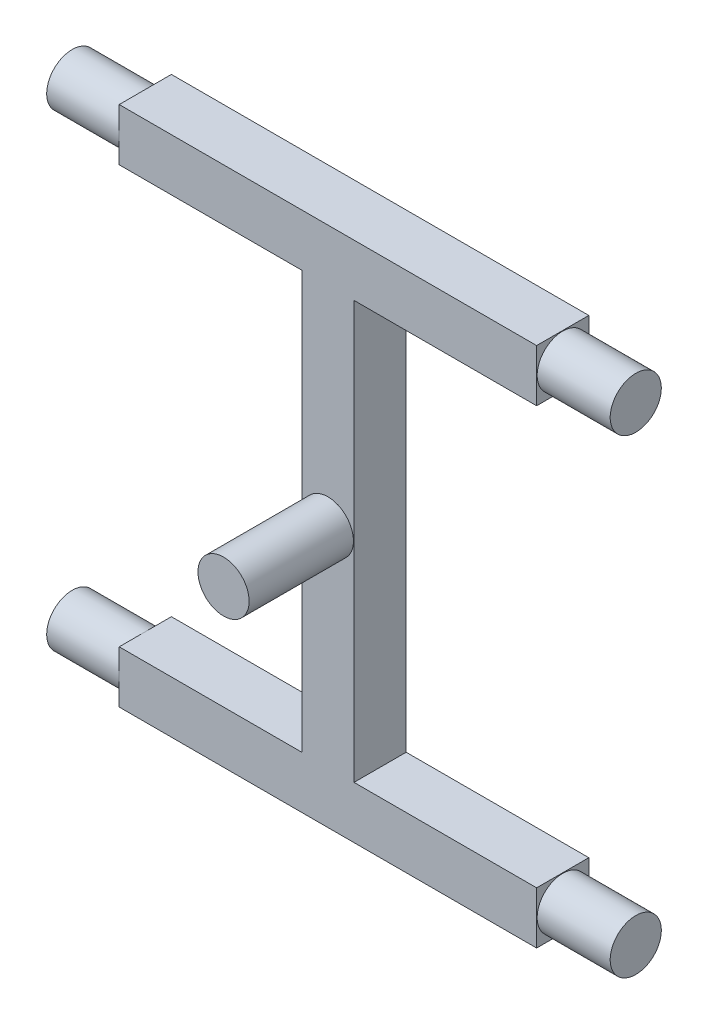
ISO-10303-21;
HEADER;
FILE_DESCRIPTION(('STEP AP214'),'2;1');
FILE_NAME('part.step','',(''),(''),'','','');
FILE_SCHEMA(('AUTOMOTIVE_DESIGN { 1 0 10303 214 1 1 1 1 }'));
ENDSEC;
DATA;
#1=APPLICATION_CONTEXT('core data for automotive mechanical design processes');
#2=APPLICATION_PROTOCOL_DEFINITION('international standard','automotive_design',2000,#1);
#3=PRODUCT_CONTEXT('',#1,'mechanical');
#4=PRODUCT('Part','Part','',(#3));
#5=PRODUCT_RELATED_PRODUCT_CATEGORY('part','',(#4));
#6=PRODUCT_DEFINITION_FORMATION('','',#4);
#7=PRODUCT_DEFINITION_CONTEXT('part definition',#1,'design');
#8=PRODUCT_DEFINITION('design','',#6,#7);
#9=PRODUCT_DEFINITION_SHAPE('','',#8);
#10=(LENGTH_UNIT() NAMED_UNIT(*) SI_UNIT(.MILLI.,.METRE.));
#11=(NAMED_UNIT(*) PLANE_ANGLE_UNIT() SI_UNIT($,.RADIAN.));
#12=(NAMED_UNIT(*) SI_UNIT($,.STERADIAN.) SOLID_ANGLE_UNIT());
#13=UNCERTAINTY_MEASURE_WITH_UNIT(LENGTH_MEASURE(1.E-05),#10,'distance_accuracy_value','');
#14=(GEOMETRIC_REPRESENTATION_CONTEXT(3) GLOBAL_UNCERTAINTY_ASSIGNED_CONTEXT((#13)) GLOBAL_UNIT_ASSIGNED_CONTEXT((#10,
#11,#12)) REPRESENTATION_CONTEXT('',''));
#15=CARTESIAN_POINT('',(0.,0.,0.));
#16=DIRECTION('',(0.,0.,1.));
#17=DIRECTION('',(1.,0.,0.));
#18=AXIS2_PLACEMENT_3D('',#15,#16,#17);
#19=CARTESIAN_POINT('',(200.,-250.,-50.));
#20=DIRECTION('',(1.,0.,0.));
#21=DIRECTION('',(0.,0.,-1.));
#22=AXIS2_PLACEMENT_3D('',#19,#20,#21);
#23=PLANE('',#22);
#24=CARTESIAN_POINT('',(200.,-225.,-25.));
#25=DIRECTION('',(1.,0.,0.));
#26=DIRECTION('',(0.,0.,-1.));
#27=AXIS2_PLACEMENT_3D('',#24,#25,#26);
#28=CIRCLE('',#27,24.5);
#29=CARTESIAN_POINT('',(200.,-225.,-49.5));
#30=VERTEX_POINT('',#29);
#31=EDGE_CURVE('E326',#30,#30,#28,.T.);
#32=ORIENTED_EDGE('',*,*,#31,.F.);
#33=EDGE_LOOP('',(#32));
#34=FACE_BOUND('',#33,.T.);
#35=DIRECTION('',(0.,0.,1.));
#36=VECTOR('',#35,1.);
#37=CARTESIAN_POINT('',(200.,-200.,-50.));
#38=LINE('',#37,#36);
#39=CARTESIAN_POINT('',(200.,-200.,-50.));
#40=VERTEX_POINT('',#39);
#41=CARTESIAN_POINT('',(200.,-200.,0.));
#42=VERTEX_POINT('',#41);
#43=EDGE_CURVE('E194',#40,#42,#38,.T.);
#44=ORIENTED_EDGE('',*,*,#43,.T.);
#45=DIRECTION('',(0.,1.,0.));
#46=VECTOR('',#45,1.);
#47=CARTESIAN_POINT('',(200.,-250.,0.));
#48=LINE('',#47,#46);
#49=CARTESIAN_POINT('',(200.,-250.,0.));
#50=VERTEX_POINT('',#49);
#51=EDGE_CURVE('E232',#50,#42,#48,.T.);
#52=ORIENTED_EDGE('',*,*,#51,.F.);
#53=DIRECTION('',(0.,0.,1.));
#54=VECTOR('',#53,1.);
#55=CARTESIAN_POINT('',(200.,-250.,-50.));
#56=LINE('',#55,#54);
#57=CARTESIAN_POINT('',(200.,-250.,-50.));
#58=VERTEX_POINT('',#57);
#59=EDGE_CURVE('E51',#58,#50,#56,.T.);
#60=ORIENTED_EDGE('',*,*,#59,.F.);
#61=DIRECTION('',(0.,1.,0.));
#62=VECTOR('',#61,1.);
#63=CARTESIAN_POINT('',(200.,-250.,-50.));
#64=LINE('',#63,#62);
#65=EDGE_CURVE('E218',#58,#40,#64,.T.);
#66=ORIENTED_EDGE('',*,*,#65,.T.);
#67=EDGE_LOOP('',(#44,#52,#60,#66));
#68=FACE_BOUND('',#67,.T.);
#69=ADVANCED_FACE('F43',(#34,#68),#23,.T.);
#70=CARTESIAN_POINT('',(-200.,-250.,-50.));
#71=DIRECTION('',(-1.,0.,0.));
#72=DIRECTION('',(0.,0.,1.));
#73=AXIS2_PLACEMENT_3D('',#70,#71,#72);
#74=PLANE('',#73);
#75=DIRECTION('',(0.,0.,1.));
#76=VECTOR('',#75,1.);
#77=CARTESIAN_POINT('',(-200.,200.,-50.));
#78=LINE('',#77,#76);
#79=CARTESIAN_POINT('',(-200.,200.,-50.));
#80=VERTEX_POINT('',#79);
#81=CARTESIAN_POINT('',(-200.,200.,-31.1141017900625));
#82=VERTEX_POINT('',#81);
#83=EDGE_CURVE('E147',#80,#82,#78,.T.);
#84=ORIENTED_EDGE('',*,*,#83,.T.);
#85=CARTESIAN_POINT('',(-200.,223.72483423126,-25.));
#86=DIRECTION('',(-1.,0.,0.));
#87=DIRECTION('',(0.,0.,1.));
#88=AXIS2_PLACEMENT_3D('',#85,#86,#87);
#89=CIRCLE('',#88,24.5);
#90=CARTESIAN_POINT('',(-200.,200.,-18.8858982099375));
#91=VERTEX_POINT('',#90);
#92=EDGE_CURVE('E149',#91,#82,#89,.T.);
#93=ORIENTED_EDGE('',*,*,#92,.F.);
#94=CARTESIAN_POINT('',(-200.,200.,0.));
#95=VERTEX_POINT('',#94);
#96=EDGE_CURVE('E137',#91,#95,#78,.T.);
#97=ORIENTED_EDGE('',*,*,#96,.T.);
#98=DIRECTION('',(0.,-1.,0.));
#99=VECTOR('',#98,1.);
#100=CARTESIAN_POINT('',(-200.,-250.,0.));
#101=LINE('',#100,#99);
#102=CARTESIAN_POINT('',(-200.,250.,0.));
#103=VERTEX_POINT('',#102);
#104=EDGE_CURVE('E239',#103,#95,#101,.T.);
#105=ORIENTED_EDGE('',*,*,#104,.F.);
#106=DIRECTION('',(0.,0.,1.));
#107=VECTOR('',#106,1.);
#108=CARTESIAN_POINT('',(-200.,250.,-50.));
#109=LINE('',#108,#107);
#110=CARTESIAN_POINT('',(-200.,250.,-50.));
#111=VERTEX_POINT('',#110);
#112=EDGE_CURVE('E248',#111,#103,#109,.T.);
#113=ORIENTED_EDGE('',*,*,#112,.F.);
#114=DIRECTION('',(0.,-1.,0.));
#115=VECTOR('',#114,1.);
#116=CARTESIAN_POINT('',(-200.,-250.,-50.));
#117=LINE('',#116,#115);
#118=EDGE_CURVE('E226',#111,#80,#117,.T.);
#119=ORIENTED_EDGE('',*,*,#118,.T.);
#120=EDGE_LOOP('',(#84,#93,#97,#105,#113,#119));
#121=FACE_BOUND('',#120,.T.);
#122=ADVANCED_FACE('F150',(#121),#74,.T.);
#123=CARTESIAN_POINT('',(200.,225.,-25.));
#124=DIRECTION('',(1.,0.,0.));
#125=DIRECTION('',(0.,0.,-1.));
#126=AXIS2_PLACEMENT_3D('',#123,#124,#125);
#127=CIRCLE('',#126,24.5);
#128=CARTESIAN_POINT('',(200.,225.,-49.5));
#129=VERTEX_POINT('',#128);
#130=EDGE_CURVE('E320',#129,#129,#127,.T.);
#131=ORIENTED_EDGE('',*,*,#130,.F.);
#132=EDGE_LOOP('',(#131));
#133=FACE_BOUND('',#132,.T.);
#134=DIRECTION('',(0.,0.,1.));
#135=VECTOR('',#134,1.);
#136=CARTESIAN_POINT('',(200.,200.,-50.));
#137=LINE('',#136,#135);
#138=CARTESIAN_POINT('',(200.,200.,-50.));
#139=VERTEX_POINT('',#138);
#140=CARTESIAN_POINT('',(200.,200.,0.));
#141=VERTEX_POINT('',#140);
#142=EDGE_CURVE('E198',#139,#141,#137,.T.);
#143=ORIENTED_EDGE('',*,*,#142,.F.);
#144=CARTESIAN_POINT('',(200.,250.,-50.));
#145=VERTEX_POINT('',#144);
#146=EDGE_CURVE('E222',#139,#145,#64,.T.);
#147=ORIENTED_EDGE('',*,*,#146,.T.);
#148=DIRECTION('',(0.,0.,1.));
#149=VECTOR('',#148,1.);
#150=CARTESIAN_POINT('',(200.,250.,-50.));
#151=LINE('',#150,#149);
#152=CARTESIAN_POINT('',(200.,250.,0.));
#153=VERTEX_POINT('',#152);
#154=EDGE_CURVE('E231',#145,#153,#151,.T.);
#155=ORIENTED_EDGE('',*,*,#154,.T.);
#156=EDGE_CURVE('E189',#141,#153,#48,.T.);
#157=ORIENTED_EDGE('',*,*,#156,.F.);
#158=EDGE_LOOP('',(#143,#147,#155,#157));
#159=FACE_BOUND('',#158,.T.);
#160=ADVANCED_FACE('F45',(#133,#159),#23,.T.);
#161=CARTESIAN_POINT('',(-200.,-250.,-50.));
#162=DIRECTION('',(0.,-1.,0.));
#163=DIRECTION('',(0.,0.,-1.));
#164=AXIS2_PLACEMENT_3D('',#161,#162,#163);
#165=PLANE('',#164);
#166=DIRECTION('',(1.,0.,0.));
#167=VECTOR('',#166,1.);
#168=CARTESIAN_POINT('',(-200.,-250.,0.));
#169=LINE('',#168,#167);
#170=CARTESIAN_POINT('',(-200.,-250.,0.));
#171=VERTEX_POINT('',#170);
#172=EDGE_CURVE('E241',#171,#50,#169,.T.);
#173=ORIENTED_EDGE('',*,*,#172,.F.);
#174=DIRECTION('',(0.,0.,1.));
#175=VECTOR('',#174,1.);
#176=CARTESIAN_POINT('',(-200.,-250.,-50.));
#177=LINE('',#176,#175);
#178=CARTESIAN_POINT('',(-200.,-250.,-50.));
#179=VERTEX_POINT('',#178);
#180=EDGE_CURVE('E245',#179,#171,#177,.T.);
#181=ORIENTED_EDGE('',*,*,#180,.F.);
#182=DIRECTION('',(1.,0.,0.));
#183=VECTOR('',#182,1.);
#184=CARTESIAN_POINT('',(-200.,-250.,-50.));
#185=LINE('',#184,#183);
#186=EDGE_CURVE('E228',#179,#58,#185,.T.);
#187=ORIENTED_EDGE('',*,*,#186,.T.);
#188=ORIENTED_EDGE('',*,*,#59,.T.);
#189=EDGE_LOOP('',(#173,#181,#187,#188));
#190=FACE_BOUND('',#189,.T.);
#191=ADVANCED_FACE('F283',(#190),#165,.T.);
#192=CARTESIAN_POINT('',(-200.,-225.045105614405,-25.));
#193=DIRECTION('',(-1.,0.,0.));
#194=DIRECTION('',(0.,0.,1.));
#195=AXIS2_PLACEMENT_3D('',#192,#193,#194);
#196=CIRCLE('',#195,24.5);
#197=CARTESIAN_POINT('',(-200.,-225.045105614405,-0.500000000000004));
#198=VERTEX_POINT('',#197);
#199=EDGE_CURVE('E163',#198,#198,#196,.T.);
#200=ORIENTED_EDGE('',*,*,#199,.F.);
#201=EDGE_LOOP('',(#200));
#202=FACE_BOUND('',#201,.T.);
#203=DIRECTION('',(0.,0.,1.));
#204=VECTOR('',#203,1.);
#205=CARTESIAN_POINT('',(-200.,-200.,-50.));
#206=LINE('',#205,#204);
#207=CARTESIAN_POINT('',(-200.,-200.,-50.));
#208=VERTEX_POINT('',#207);
#209=CARTESIAN_POINT('',(-200.,-200.,0.));
#210=VERTEX_POINT('',#209);
#211=EDGE_CURVE('E66',#208,#210,#206,.T.);
#212=ORIENTED_EDGE('',*,*,#211,.F.);
#213=EDGE_CURVE('E225',#208,#179,#117,.T.);
#214=ORIENTED_EDGE('',*,*,#213,.T.);
#215=ORIENTED_EDGE('',*,*,#180,.T.);
#216=EDGE_CURVE('E238',#210,#171,#101,.T.);
#217=ORIENTED_EDGE('',*,*,#216,.F.);
#218=EDGE_LOOP('',(#212,#214,#215,#217));
#219=FACE_BOUND('',#218,.T.);
#220=ADVANCED_FACE('F277',(#202,#219),#74,.T.);
#221=CARTESIAN_POINT('',(-200.,250.,-50.));
#222=DIRECTION('',(0.,1.,0.));
#223=DIRECTION('',(0.,0.,1.));
#224=AXIS2_PLACEMENT_3D('',#221,#222,#223);
#225=PLANE('',#224);
#226=DIRECTION('',(-1.,0.,0.));
#227=VECTOR('',#226,1.);
#228=CARTESIAN_POINT('',(-200.,250.,0.));
#229=LINE('',#228,#227);
#230=EDGE_CURVE('E235',#153,#103,#229,.T.);
#231=ORIENTED_EDGE('',*,*,#230,.F.);
#232=ORIENTED_EDGE('',*,*,#154,.F.);
#233=DIRECTION('',(-1.,0.,0.));
#234=VECTOR('',#233,1.);
#235=CARTESIAN_POINT('',(-200.,250.,-50.));
#236=LINE('',#235,#234);
#237=EDGE_CURVE('E221',#145,#111,#236,.T.);
#238=ORIENTED_EDGE('',*,*,#237,.T.);
#239=ORIENTED_EDGE('',*,*,#112,.T.);
#240=EDGE_LOOP('',(#231,#232,#238,#239));
#241=FACE_BOUND('',#240,.T.);
#242=ADVANCED_FACE('F258',(#241),#225,.T.);
#243=CARTESIAN_POINT('',(0.,0.,-50.));
#244=DIRECTION('',(0.,0.,-1.));
#245=DIRECTION('',(-1.,0.,0.));
#246=AXIS2_PLACEMENT_3D('',#243,#244,#245);
#247=PLANE('',#246);
#248=DIRECTION('',(-1.,0.,0.));
#249=VECTOR('',#248,1.);
#250=CARTESIAN_POINT('',(-200.,200.,-50.));
#251=LINE('',#250,#249);
#252=CARTESIAN_POINT('',(-25.0000000000002,200.,-50.));
#253=VERTEX_POINT('',#252);
#254=EDGE_CURVE('E179',#253,#80,#251,.T.);
#255=ORIENTED_EDGE('',*,*,#254,.T.);
#256=ORIENTED_EDGE('',*,*,#118,.F.);
#257=ORIENTED_EDGE('',*,*,#237,.F.);
#258=ORIENTED_EDGE('',*,*,#146,.F.);
#259=DIRECTION('',(-1.,0.,0.));
#260=VECTOR('',#259,1.);
#261=CARTESIAN_POINT('',(200.,200.,-50.));
#262=LINE('',#261,#260);
#263=CARTESIAN_POINT('',(25.0000000000002,200.,-50.));
#264=VERTEX_POINT('',#263);
#265=EDGE_CURVE('E213',#139,#264,#262,.T.);
#266=ORIENTED_EDGE('',*,*,#265,.T.);
#267=DIRECTION('',(0.,-1.,0.));
#268=VECTOR('',#267,1.);
#269=CARTESIAN_POINT('',(25.0000000000002,200.,-50.));
#270=LINE('',#269,#268);
#271=CARTESIAN_POINT('',(25.0000000000001,-200.,-50.));
#272=VERTEX_POINT('',#271);
#273=EDGE_CURVE('E197',#264,#272,#270,.T.);
#274=ORIENTED_EDGE('',*,*,#273,.T.);
#275=DIRECTION('',(1.,0.,0.));
#276=VECTOR('',#275,1.);
#277=CARTESIAN_POINT('',(25.0000000000001,-200.,-50.));
#278=LINE('',#277,#276);
#279=EDGE_CURVE('E207',#272,#40,#278,.T.);
#280=ORIENTED_EDGE('',*,*,#279,.T.);
#281=ORIENTED_EDGE('',*,*,#65,.F.);
#282=ORIENTED_EDGE('',*,*,#186,.F.);
#283=ORIENTED_EDGE('',*,*,#213,.F.);
#284=DIRECTION('',(1.,0.,0.));
#285=VECTOR('',#284,1.);
#286=CARTESIAN_POINT('',(-25.0000000000001,-200.,-50.));
#287=LINE('',#286,#285);
#288=CARTESIAN_POINT('',(-25.0000000000001,-200.,-50.));
#289=VERTEX_POINT('',#288);
#290=EDGE_CURVE('E173',#208,#289,#287,.T.);
#291=ORIENTED_EDGE('',*,*,#290,.T.);
#292=DIRECTION('',(0.,1.,0.));
#293=VECTOR('',#292,1.);
#294=CARTESIAN_POINT('',(-25.0000000000002,200.,-50.));
#295=LINE('',#294,#293);
#296=EDGE_CURVE('E176',#289,#253,#295,.T.);
#297=ORIENTED_EDGE('',*,*,#296,.T.);
#298=EDGE_LOOP('',(#255,#256,#257,#258,#266,#274,#280,#281,#282,#283,#291,#297));
#299=FACE_BOUND('',#298,.T.);
#300=ADVANCED_FACE('F268',(#299),#247,.T.);
#301=CARTESIAN_POINT('',(0.,0.,0.));
#302=DIRECTION('',(0.,0.,-1.));
#303=DIRECTION('',(-1.,0.,0.));
#304=AXIS2_PLACEMENT_3D('',#301,#302,#303);
#305=PLANE('',#304);
#306=CARTESIAN_POINT('',(0.,0.,0.));
#307=DIRECTION('',(0.,0.,-1.));
#308=DIRECTION('',(-1.,0.,0.));
#309=AXIS2_PLACEMENT_3D('',#306,#307,#308);
#310=CIRCLE('',#309,24.5);
#311=CARTESIAN_POINT('',(-24.5,0.,0.));
#312=VERTEX_POINT('',#311);
#313=EDGE_CURVE('E11',#312,#312,#310,.F.);
#314=ORIENTED_EDGE('',*,*,#313,.F.);
#315=EDGE_LOOP('',(#314));
#316=FACE_BOUND('',#315,.T.);
#317=ORIENTED_EDGE('',*,*,#104,.T.);
#318=DIRECTION('',(-1.,0.,0.));
#319=VECTOR('',#318,1.);
#320=CARTESIAN_POINT('',(-200.,200.,0.));
#321=LINE('',#320,#319);
#322=CARTESIAN_POINT('',(-25.0000000000002,200.,0.));
#323=VERTEX_POINT('',#322);
#324=EDGE_CURVE('E141',#323,#95,#321,.T.);
#325=ORIENTED_EDGE('',*,*,#324,.F.);
#326=DIRECTION('',(0.,1.,0.));
#327=VECTOR('',#326,1.);
#328=CARTESIAN_POINT('',(-25.0000000000002,200.,0.));
#329=LINE('',#328,#327);
#330=CARTESIAN_POINT('',(-25.0000000000001,-200.,0.));
#331=VERTEX_POINT('',#330);
#332=EDGE_CURVE('E184',#331,#323,#329,.T.);
#333=ORIENTED_EDGE('',*,*,#332,.F.);
#334=DIRECTION('',(1.,0.,0.));
#335=VECTOR('',#334,1.);
#336=CARTESIAN_POINT('',(-25.0000000000001,-200.,0.));
#337=LINE('',#336,#335);
#338=EDGE_CURVE('E182',#210,#331,#337,.T.);
#339=ORIENTED_EDGE('',*,*,#338,.F.);
#340=ORIENTED_EDGE('',*,*,#216,.T.);
#341=ORIENTED_EDGE('',*,*,#172,.T.);
#342=ORIENTED_EDGE('',*,*,#51,.T.);
#343=DIRECTION('',(1.,0.,0.));
#344=VECTOR('',#343,1.);
#345=CARTESIAN_POINT('',(25.0000000000001,-200.,0.));
#346=LINE('',#345,#344);
#347=CARTESIAN_POINT('',(25.0000000000001,-200.,0.));
#348=VERTEX_POINT('',#347);
#349=EDGE_CURVE('E185',#348,#42,#346,.T.);
#350=ORIENTED_EDGE('',*,*,#349,.F.);
#351=DIRECTION('',(0.,-1.,0.));
#352=VECTOR('',#351,1.);
#353=CARTESIAN_POINT('',(25.0000000000002,200.,0.));
#354=LINE('',#353,#352);
#355=CARTESIAN_POINT('',(25.0000000000002,200.,0.));
#356=VERTEX_POINT('',#355);
#357=EDGE_CURVE('E203',#356,#348,#354,.T.);
#358=ORIENTED_EDGE('',*,*,#357,.F.);
#359=DIRECTION('',(-1.,0.,0.));
#360=VECTOR('',#359,1.);
#361=CARTESIAN_POINT('',(200.,200.,0.));
#362=LINE('',#361,#360);
#363=EDGE_CURVE('E206',#141,#356,#362,.T.);
#364=ORIENTED_EDGE('',*,*,#363,.F.);
#365=ORIENTED_EDGE('',*,*,#156,.T.);
#366=ORIENTED_EDGE('',*,*,#230,.T.);
#367=EDGE_LOOP('',(#317,#325,#333,#339,#340,#341,#342,#350,#358,#364,#365,#366));
#368=FACE_BOUND('',#367,.T.);
#369=ADVANCED_FACE('F260',(#316,#368),#305,.F.);
#370=CARTESIAN_POINT('',(25.0000000000001,-200.,-50.));
#371=DIRECTION('',(0.,-1.,0.));
#372=DIRECTION('',(0.,0.,-1.));
#373=AXIS2_PLACEMENT_3D('',#370,#371,#372);
#374=PLANE('',#373);
#375=ORIENTED_EDGE('',*,*,#349,.T.);
#376=ORIENTED_EDGE('',*,*,#43,.F.);
#377=ORIENTED_EDGE('',*,*,#279,.F.);
#378=DIRECTION('',(0.,0.,1.));
#379=VECTOR('',#378,1.);
#380=CARTESIAN_POINT('',(25.0000000000001,-200.,-50.));
#381=LINE('',#380,#379);
#382=EDGE_CURVE('E170',#272,#348,#381,.T.);
#383=ORIENTED_EDGE('',*,*,#382,.T.);
#384=EDGE_LOOP('',(#375,#376,#377,#383));
#385=FACE_BOUND('',#384,.T.);
#386=ADVANCED_FACE('F289',(#385),#374,.F.);
#387=CARTESIAN_POINT('',(25.0000000000002,200.,-50.));
#388=DIRECTION('',(-1.,0.,0.));
#389=DIRECTION('',(0.,-1.,0.));
#390=AXIS2_PLACEMENT_3D('',#387,#388,#389);
#391=PLANE('',#390);
#392=ORIENTED_EDGE('',*,*,#357,.T.);
#393=ORIENTED_EDGE('',*,*,#382,.F.);
#394=ORIENTED_EDGE('',*,*,#273,.F.);
#395=DIRECTION('',(0.,0.,1.));
#396=VECTOR('',#395,1.);
#397=CARTESIAN_POINT('',(25.0000000000002,200.,-50.));
#398=LINE('',#397,#396);
#399=EDGE_CURVE('E200',#264,#356,#398,.T.);
#400=ORIENTED_EDGE('',*,*,#399,.T.);
#401=EDGE_LOOP('',(#392,#393,#394,#400));
#402=FACE_BOUND('',#401,.T.);
#403=ADVANCED_FACE('F291',(#402),#391,.F.);
#404=CARTESIAN_POINT('',(200.,200.,-50.));
#405=DIRECTION('',(0.,1.,0.));
#406=DIRECTION('',(0.,0.,1.));
#407=AXIS2_PLACEMENT_3D('',#404,#405,#406);
#408=PLANE('',#407);
#409=ORIENTED_EDGE('',*,*,#363,.T.);
#410=ORIENTED_EDGE('',*,*,#399,.F.);
#411=ORIENTED_EDGE('',*,*,#265,.F.);
#412=ORIENTED_EDGE('',*,*,#142,.T.);
#413=EDGE_LOOP('',(#409,#410,#411,#412));
#414=FACE_BOUND('',#413,.T.);
#415=ADVANCED_FACE('F265',(#414),#408,.F.);
#416=CARTESIAN_POINT('',(-200.,200.,-50.));
#417=DIRECTION('',(0.,1.,0.));
#418=DIRECTION('',(0.,0.,1.));
#419=AXIS2_PLACEMENT_3D('',#416,#417,#418);
#420=PLANE('',#419);
#421=ORIENTED_EDGE('',*,*,#324,.T.);
#422=ORIENTED_EDGE('',*,*,#96,.F.);
#423=EDGE_CURVE('E58',#82,#91,#78,.T.);
#424=ORIENTED_EDGE('',*,*,#423,.F.);
#425=ORIENTED_EDGE('',*,*,#83,.F.);
#426=ORIENTED_EDGE('',*,*,#254,.F.);
#427=DIRECTION('',(0.,0.,1.));
#428=VECTOR('',#427,1.);
#429=CARTESIAN_POINT('',(-25.0000000000002,200.,-50.));
#430=LINE('',#429,#428);
#431=EDGE_CURVE('E145',#253,#323,#430,.T.);
#432=ORIENTED_EDGE('',*,*,#431,.T.);
#433=EDGE_LOOP('',(#421,#422,#424,#425,#426,#432));
#434=FACE_BOUND('',#433,.T.);
#435=ADVANCED_FACE('F139',(#434),#420,.F.);
#436=CARTESIAN_POINT('',(-25.0000000000002,200.,-50.));
#437=DIRECTION('',(1.,0.,0.));
#438=DIRECTION('',(0.,1.,0.));
#439=AXIS2_PLACEMENT_3D('',#436,#437,#438);
#440=PLANE('',#439);
#441=ORIENTED_EDGE('',*,*,#332,.T.);
#442=ORIENTED_EDGE('',*,*,#431,.F.);
#443=ORIENTED_EDGE('',*,*,#296,.F.);
#444=DIRECTION('',(0.,0.,1.));
#445=VECTOR('',#444,1.);
#446=CARTESIAN_POINT('',(-25.0000000000001,-200.,-50.));
#447=LINE('',#446,#445);
#448=EDGE_CURVE('E191',#289,#331,#447,.T.);
#449=ORIENTED_EDGE('',*,*,#448,.T.);
#450=EDGE_LOOP('',(#441,#442,#443,#449));
#451=FACE_BOUND('',#450,.T.);
#452=ADVANCED_FACE('F274',(#451),#440,.F.);
#453=CARTESIAN_POINT('',(-25.0000000000001,-200.,-50.));
#454=DIRECTION('',(0.,-1.,0.));
#455=DIRECTION('',(0.,0.,-1.));
#456=AXIS2_PLACEMENT_3D('',#453,#454,#455);
#457=PLANE('',#456);
#458=ORIENTED_EDGE('',*,*,#338,.T.);
#459=ORIENTED_EDGE('',*,*,#448,.F.);
#460=ORIENTED_EDGE('',*,*,#290,.F.);
#461=ORIENTED_EDGE('',*,*,#211,.T.);
#462=EDGE_LOOP('',(#458,#459,#460,#461));
#463=FACE_BOUND('',#462,.T.);
#464=ADVANCED_FACE('F361',(#463),#457,.F.);
#465=CARTESIAN_POINT('',(-270.,-225.045105614405,-25.));
#466=DIRECTION('',(1.,0.,0.));
#467=DIRECTION('',(0.,0.,-1.));
#468=AXIS2_PLACEMENT_3D('',#465,#466,#467);
#469=CYLINDRICAL_SURFACE('',#468,24.5);
#470=CARTESIAN_POINT('',(-270.,-225.045105614405,-25.));
#471=DIRECTION('',(-1.,0.,0.));
#472=DIRECTION('',(0.,0.,1.));
#473=AXIS2_PLACEMENT_3D('',#470,#471,#472);
#474=CIRCLE('',#473,24.5);
#475=CARTESIAN_POINT('',(-270.,-225.045105614405,-0.500000000000004));
#476=VERTEX_POINT('',#475);
#477=EDGE_CURVE('E167',#476,#476,#474,.T.);
#478=ORIENTED_EDGE('',*,*,#477,.F.);
#479=EDGE_LOOP('',(#478));
#480=FACE_BOUND('',#479,.T.);
#481=ORIENTED_EDGE('',*,*,#199,.T.);
#482=EDGE_LOOP('',(#481));
#483=FACE_BOUND('',#482,.T.);
#484=ADVANCED_FACE('F357',(#480,#483),#469,.T.);
#485=CARTESIAN_POINT('',(-270.,-225.045105614405,-25.));
#486=DIRECTION('',(-1.,0.,0.));
#487=DIRECTION('',(0.,0.,1.));
#488=AXIS2_PLACEMENT_3D('',#485,#486,#487);
#489=PLANE('',#488);
#490=ORIENTED_EDGE('',*,*,#477,.T.);
#491=EDGE_LOOP('',(#490));
#492=FACE_BOUND('',#491,.T.);
#493=ADVANCED_FACE('F351',(#492),#489,.T.);
#494=CARTESIAN_POINT('',(-200.,223.72483423126,-25.));
#495=DIRECTION('',(-1.,0.,0.));
#496=DIRECTION('',(0.,0.,1.));
#497=AXIS2_PLACEMENT_3D('',#494,#495,#496);
#498=PLANE('',#497);
#499=EDGE_CURVE('E155',#82,#91,#89,.T.);
#500=ORIENTED_EDGE('',*,*,#499,.F.);
#501=ORIENTED_EDGE('',*,*,#423,.T.);
#502=EDGE_LOOP('',(#500,#501));
#503=FACE_BOUND('',#502,.T.);
#504=ADVANCED_FACE('F159',(#503),#498,.F.);
#505=CARTESIAN_POINT('',(-270.,223.72483423126,-25.));
#506=DIRECTION('',(1.,0.,0.));
#507=DIRECTION('',(0.,0.,-1.));
#508=AXIS2_PLACEMENT_3D('',#505,#506,#507);
#509=CYLINDRICAL_SURFACE('',#508,24.5);
#510=CARTESIAN_POINT('',(-270.,223.72483423126,-25.));
#511=DIRECTION('',(-1.,0.,0.));
#512=DIRECTION('',(0.,0.,1.));
#513=AXIS2_PLACEMENT_3D('',#510,#511,#512);
#514=CIRCLE('',#513,24.5);
#515=CARTESIAN_POINT('',(-270.,223.72483423126,-0.500000000000004));
#516=VERTEX_POINT('',#515);
#517=EDGE_CURVE('E161',#516,#516,#514,.T.);
#518=ORIENTED_EDGE('',*,*,#517,.F.);
#519=EDGE_LOOP('',(#518));
#520=FACE_BOUND('',#519,.T.);
#521=ORIENTED_EDGE('',*,*,#499,.T.);
#522=ORIENTED_EDGE('',*,*,#92,.T.);
#523=EDGE_LOOP('',(#521,#522));
#524=FACE_BOUND('',#523,.T.);
#525=ADVANCED_FACE('F160',(#520,#524),#509,.T.);
#526=CARTESIAN_POINT('',(-270.,223.72483423126,-25.));
#527=DIRECTION('',(-1.,0.,0.));
#528=DIRECTION('',(0.,0.,1.));
#529=AXIS2_PLACEMENT_3D('',#526,#527,#528);
#530=PLANE('',#529);
#531=ORIENTED_EDGE('',*,*,#517,.T.);
#532=EDGE_LOOP('',(#531));
#533=FACE_BOUND('',#532,.T.);
#534=ADVANCED_FACE('F336',(#533),#530,.T.);
#535=CARTESIAN_POINT('',(270.,-225.,-25.));
#536=DIRECTION('',(-1.,0.,0.));
#537=DIRECTION('',(0.,0.,1.));
#538=AXIS2_PLACEMENT_3D('',#535,#536,#537);
#539=CYLINDRICAL_SURFACE('',#538,24.5);
#540=CARTESIAN_POINT('',(270.,-225.,-25.));
#541=DIRECTION('',(1.,0.,0.));
#542=DIRECTION('',(0.,0.,-1.));
#543=AXIS2_PLACEMENT_3D('',#540,#541,#542);
#544=CIRCLE('',#543,24.5);
#545=CARTESIAN_POINT('',(270.,-225.,-49.5));
#546=VERTEX_POINT('',#545);
#547=EDGE_CURVE('E156',#546,#546,#544,.T.);
#548=ORIENTED_EDGE('',*,*,#547,.F.);
#549=EDGE_LOOP('',(#548));
#550=FACE_BOUND('',#549,.T.);
#551=ORIENTED_EDGE('',*,*,#31,.T.);
#552=EDGE_LOOP('',(#551));
#553=FACE_BOUND('',#552,.T.);
#554=ADVANCED_FACE('F334',(#550,#553),#539,.T.);
#555=CARTESIAN_POINT('',(270.,-225.,-25.));
#556=DIRECTION('',(1.,0.,0.));
#557=DIRECTION('',(0.,0.,-1.));
#558=AXIS2_PLACEMENT_3D('',#555,#556,#557);
#559=PLANE('',#558);
#560=ORIENTED_EDGE('',*,*,#547,.T.);
#561=EDGE_LOOP('',(#560));
#562=FACE_BOUND('',#561,.T.);
#563=ADVANCED_FACE('F335',(#562),#559,.T.);
#564=CARTESIAN_POINT('',(270.,225.,-25.));
#565=DIRECTION('',(-1.,0.,0.));
#566=DIRECTION('',(0.,0.,1.));
#567=AXIS2_PLACEMENT_3D('',#564,#565,#566);
#568=CYLINDRICAL_SURFACE('',#567,24.5);
#569=CARTESIAN_POINT('',(270.,225.,-25.));
#570=DIRECTION('',(1.,0.,0.));
#571=DIRECTION('',(0.,0.,-1.));
#572=AXIS2_PLACEMENT_3D('',#569,#570,#571);
#573=CIRCLE('',#572,24.5);
#574=CARTESIAN_POINT('',(270.,225.,-49.5));
#575=VERTEX_POINT('',#574);
#576=EDGE_CURVE('E322',#575,#575,#573,.T.);
#577=ORIENTED_EDGE('',*,*,#576,.F.);
#578=EDGE_LOOP('',(#577));
#579=FACE_BOUND('',#578,.T.);
#580=ORIENTED_EDGE('',*,*,#130,.T.);
#581=EDGE_LOOP('',(#580));
#582=FACE_BOUND('',#581,.T.);
#583=ADVANCED_FACE('F341',(#579,#582),#568,.T.);
#584=CARTESIAN_POINT('',(270.,225.,-25.));
#585=DIRECTION('',(1.,0.,0.));
#586=DIRECTION('',(0.,0.,-1.));
#587=AXIS2_PLACEMENT_3D('',#584,#585,#586);
#588=PLANE('',#587);
#589=ORIENTED_EDGE('',*,*,#576,.T.);
#590=EDGE_LOOP('',(#589));
#591=FACE_BOUND('',#590,.T.);
#592=ADVANCED_FACE('F436',(#591),#588,.T.);
#593=CARTESIAN_POINT('',(0.,0.,100.));
#594=DIRECTION('',(0.,0.,-1.));
#595=DIRECTION('',(-1.,0.,0.));
#596=AXIS2_PLACEMENT_3D('',#593,#594,#595);
#597=CYLINDRICAL_SURFACE('',#596,24.5);
#598=CARTESIAN_POINT('',(0.,0.,100.));
#599=DIRECTION('',(0.,0.,1.));
#600=DIRECTION('',(1.,0.,0.));
#601=AXIS2_PLACEMENT_3D('',#598,#599,#600);
#602=CIRCLE('',#601,24.5);
#603=CARTESIAN_POINT('',(24.5,0.,100.));
#604=VERTEX_POINT('',#603);
#605=EDGE_CURVE('E323',#604,#604,#602,.T.);
#606=ORIENTED_EDGE('',*,*,#605,.F.);
#607=EDGE_LOOP('',(#606));
#608=FACE_BOUND('',#607,.T.);
#609=ORIENTED_EDGE('',*,*,#313,.T.);
#610=EDGE_LOOP('',(#609));
#611=FACE_BOUND('',#610,.T.);
#612=ADVANCED_FACE('F445',(#608,#611),#597,.T.);
#613=CARTESIAN_POINT('',(0.,0.,100.));
#614=DIRECTION('',(0.,0.,1.));
#615=DIRECTION('',(1.,0.,0.));
#616=AXIS2_PLACEMENT_3D('',#613,#614,#615);
#617=PLANE('',#616);
#618=ORIENTED_EDGE('',*,*,#605,.T.);
#619=EDGE_LOOP('',(#618));
#620=FACE_BOUND('',#619,.T.);
#621=ADVANCED_FACE('F456',(#620),#617,.T.);
#622=CLOSED_SHELL('',(#69,#122,#160,#191,#220,#242,#300,#369,#386,#403,#415,#435,#452,#464,#484,
#493,#504,#525,#534,#554,#563,#583,#592,#612,#621));
#623=MANIFOLD_SOLID_BREP('B2',#622);
#624=ADVANCED_BREP_SHAPE_REPRESENTATION('',(#18,#623),#14);
#625=SHAPE_DEFINITION_REPRESENTATION(#9,#624);
ENDSEC;
END-ISO-10303-21;
